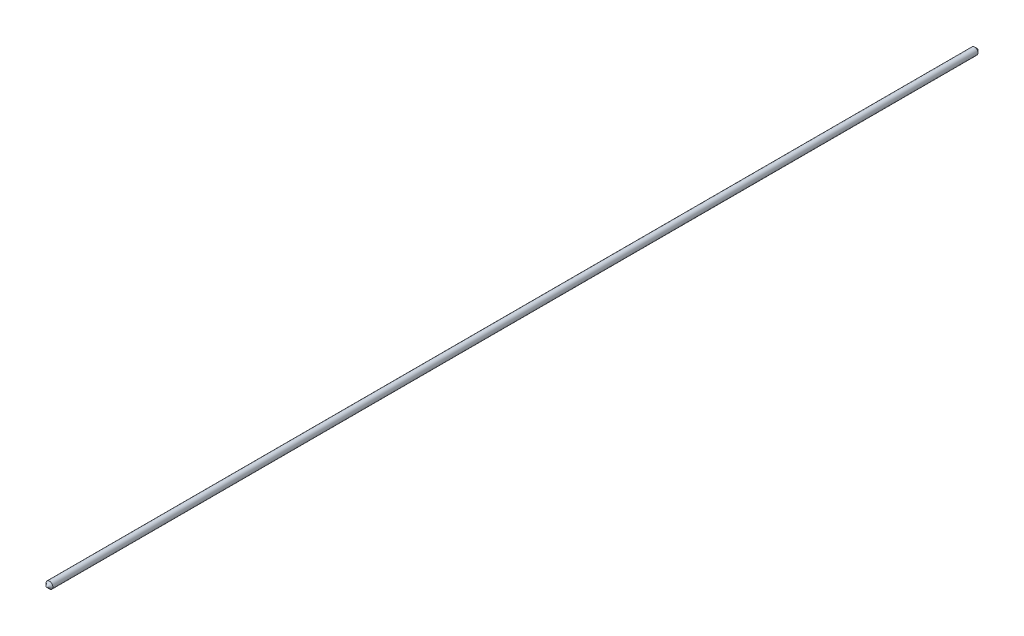
ISO-10303-21;
HEADER;
FILE_DESCRIPTION(('STEP AP214'),'2;1');
FILE_NAME('part.step','',(''),(''),'','','');
FILE_SCHEMA(('AUTOMOTIVE_DESIGN { 1 0 10303 214 1 1 1 1 }'));
ENDSEC;
DATA;
#1=APPLICATION_CONTEXT('core data for automotive mechanical design processes');
#2=APPLICATION_PROTOCOL_DEFINITION('international standard','automotive_design',2000,#1);
#3=PRODUCT_CONTEXT('',#1,'mechanical');
#4=PRODUCT('Part','Part','',(#3));
#5=PRODUCT_RELATED_PRODUCT_CATEGORY('part','',(#4));
#6=PRODUCT_DEFINITION_FORMATION('','',#4);
#7=PRODUCT_DEFINITION_CONTEXT('part definition',#1,'design');
#8=PRODUCT_DEFINITION('design','',#6,#7);
#9=PRODUCT_DEFINITION_SHAPE('','',#8);
#10=(LENGTH_UNIT() NAMED_UNIT(*) SI_UNIT(.MILLI.,.METRE.));
#11=(NAMED_UNIT(*) PLANE_ANGLE_UNIT() SI_UNIT($,.RADIAN.));
#12=(NAMED_UNIT(*) SI_UNIT($,.STERADIAN.) SOLID_ANGLE_UNIT());
#13=UNCERTAINTY_MEASURE_WITH_UNIT(LENGTH_MEASURE(1.E-05),#10,'distance_accuracy_value','');
#14=(GEOMETRIC_REPRESENTATION_CONTEXT(3) GLOBAL_UNCERTAINTY_ASSIGNED_CONTEXT((#13)) GLOBAL_UNIT_ASSIGNED_CONTEXT((#10,
#11,#12)) REPRESENTATION_CONTEXT('',''));
#15=CARTESIAN_POINT('',(0.,0.,0.));
#16=DIRECTION('',(0.,0.,1.));
#17=DIRECTION('',(1.,0.,0.));
#18=AXIS2_PLACEMENT_3D('',#15,#16,#17);
#19=CARTESIAN_POINT('',(0.,0.,-34.1758438695135));
#20=DIRECTION('',(0.,0.,-1.));
#21=DIRECTION('',(0.,1.,0.));
#22=AXIS2_PLACEMENT_3D('',#19,#20,#21);
#23=CONICAL_SURFACE('',#22,10.,0.790459618228235);
#24=CARTESIAN_POINT('',(0.,0.,-24.2765640356533));
#25=VERTEX_POINT('',#24);
#26=VERTEX_LOOP('',#25);
#27=FACE_BOUND('',#26,.T.);
#28=CARTESIAN_POINT('',(0.,0.,-34.1758438695135));
#29=DIRECTION('',(0.,0.,1.));
#30=DIRECTION('',(0.,-1.,0.));
#31=AXIS2_PLACEMENT_3D('',#28,#29,#30);
#32=CIRCLE('',#31,10.);
#33=CARTESIAN_POINT('',(0.,-10.,-34.1758438695135));
#34=VERTEX_POINT('',#33);
#35=EDGE_CURVE('E47',#34,#34,#32,.T.);
#36=ORIENTED_EDGE('',*,*,#35,.T.);
#37=EDGE_LOOP('',(#36));
#38=FACE_BOUND('',#37,.T.);
#39=ADVANCED_FACE('F39',(#27,#38),#23,.T.);
#40=CARTESIAN_POINT('',(0.,0.,-2753.74556403565));
#41=DIRECTION('',(0.,0.,1.));
#42=DIRECTION('',(0.,-1.,0.));
#43=AXIS2_PLACEMENT_3D('',#40,#41,#42);
#44=CONICAL_SURFACE('',#43,0.,0.780162175641453);
#45=CARTESIAN_POINT('',(0.,0.,-2743.64029211602));
#46=DIRECTION('',(0.,0.,1.));
#47=DIRECTION('',(0.,-1.,0.));
#48=AXIS2_PLACEMENT_3D('',#45,#46,#47);
#49=CIRCLE('',#48,10.);
#50=CARTESIAN_POINT('',(0.,-10.,-2743.64029211602));
#51=VERTEX_POINT('',#50);
#52=EDGE_CURVE('E11',#51,#51,#49,.T.);
#53=ORIENTED_EDGE('',*,*,#52,.F.);
#54=EDGE_LOOP('',(#53));
#55=FACE_BOUND('',#54,.T.);
#56=CARTESIAN_POINT('',(0.,0.,-2753.74556403565));
#57=VERTEX_POINT('',#56);
#58=VERTEX_LOOP('',#57);
#59=FACE_BOUND('',#58,.T.);
#60=ADVANCED_FACE('F53',(#55,#59),#44,.T.);
#61=CARTESIAN_POINT('',(0.,0.,-24.2765640356533));
#62=DIRECTION('',(0.,0.,1.));
#63=DIRECTION('',(0.,-1.,0.));
#64=AXIS2_PLACEMENT_3D('',#61,#62,#63);
#65=CYLINDRICAL_SURFACE('',#64,10.);
#66=ORIENTED_EDGE('',*,*,#35,.F.);
#67=EDGE_LOOP('',(#66));
#68=FACE_BOUND('',#67,.T.);
#69=ORIENTED_EDGE('',*,*,#52,.T.);
#70=EDGE_LOOP('',(#69));
#71=FACE_BOUND('',#70,.T.);
#72=ADVANCED_FACE('F55',(#68,#71),#65,.T.);
#73=CLOSED_SHELL('',(#39,#60,#72));
#74=MANIFOLD_SOLID_BREP('B2',#73);
#75=ADVANCED_BREP_SHAPE_REPRESENTATION('',(#18,#74),#14);
#76=SHAPE_DEFINITION_REPRESENTATION(#9,#75);
ENDSEC;
END-ISO-10303-21;
